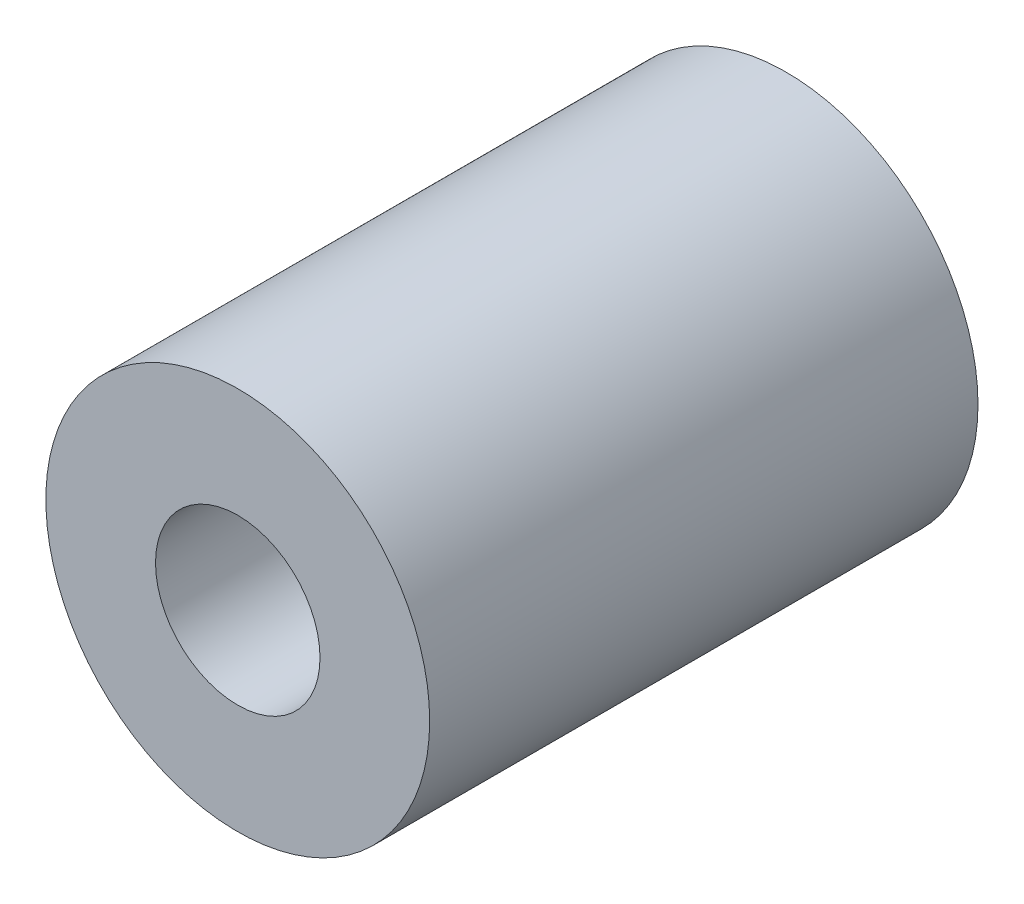
ISO-10303-21;
HEADER;
FILE_DESCRIPTION(('STEP AP214'),'2;1');
FILE_NAME('part.step','',(''),(''),'','','');
FILE_SCHEMA(('AUTOMOTIVE_DESIGN { 1 0 10303 214 1 1 1 1 }'));
ENDSEC;
DATA;
#1=APPLICATION_CONTEXT('core data for automotive mechanical design processes');
#2=APPLICATION_PROTOCOL_DEFINITION('international standard','automotive_design',2000,#1);
#3=PRODUCT_CONTEXT('',#1,'mechanical');
#4=PRODUCT('Part','Part','',(#3));
#5=PRODUCT_RELATED_PRODUCT_CATEGORY('part','',(#4));
#6=PRODUCT_DEFINITION_FORMATION('','',#4);
#7=PRODUCT_DEFINITION_CONTEXT('part definition',#1,'design');
#8=PRODUCT_DEFINITION('design','',#6,#7);
#9=PRODUCT_DEFINITION_SHAPE('','',#8);
#10=(LENGTH_UNIT() NAMED_UNIT(*) SI_UNIT(.MILLI.,.METRE.));
#11=(NAMED_UNIT(*) PLANE_ANGLE_UNIT() SI_UNIT($,.RADIAN.));
#12=(NAMED_UNIT(*) SI_UNIT($,.STERADIAN.) SOLID_ANGLE_UNIT());
#13=UNCERTAINTY_MEASURE_WITH_UNIT(LENGTH_MEASURE(1.E-05),#10,'distance_accuracy_value','');
#14=(GEOMETRIC_REPRESENTATION_CONTEXT(3) GLOBAL_UNCERTAINTY_ASSIGNED_CONTEXT((#13)) GLOBAL_UNIT_ASSIGNED_CONTEXT((#10,
#11,#12)) REPRESENTATION_CONTEXT('',''));
#15=CARTESIAN_POINT('',(0.,0.,0.));
#16=DIRECTION('',(0.,0.,1.));
#17=DIRECTION('',(1.,0.,0.));
#18=AXIS2_PLACEMENT_3D('',#15,#16,#17);
#19=CARTESIAN_POINT('',(0.,0.,10.));
#20=DIRECTION('',(0.,0.,1.));
#21=DIRECTION('',(1.,0.,0.));
#22=AXIS2_PLACEMENT_3D('',#19,#20,#21);
#23=PLANE('',#22);
#24=CARTESIAN_POINT('',(0.,0.,10.));
#25=DIRECTION('',(0.,0.,1.));
#26=DIRECTION('',(1.,0.,0.));
#27=AXIS2_PLACEMENT_3D('',#24,#25,#26);
#28=CIRCLE('',#27,3.5);
#29=CARTESIAN_POINT('',(3.5,0.,10.));
#30=VERTEX_POINT('',#29);
#31=EDGE_CURVE('E10',#30,#30,#28,.T.);
#32=ORIENTED_EDGE('',*,*,#31,.T.);
#33=EDGE_LOOP('',(#32));
#34=FACE_BOUND('',#33,.T.);
#35=CARTESIAN_POINT('',(0.,0.,10.));
#36=DIRECTION('',(0.,0.,1.));
#37=DIRECTION('',(1.,0.,0.));
#38=AXIS2_PLACEMENT_3D('',#35,#36,#37);
#39=CIRCLE('',#38,1.5);
#40=CARTESIAN_POINT('',(1.5,0.,10.));
#41=VERTEX_POINT('',#40);
#42=EDGE_CURVE('E50',#41,#41,#39,.T.);
#43=ORIENTED_EDGE('',*,*,#42,.F.);
#44=EDGE_LOOP('',(#43));
#45=FACE_BOUND('',#44,.T.);
#46=ADVANCED_FACE('F37',(#34,#45),#23,.T.);
#47=CARTESIAN_POINT('',(0.,0.,0.));
#48=DIRECTION('',(0.,0.,1.));
#49=DIRECTION('',(1.,0.,0.));
#50=AXIS2_PLACEMENT_3D('',#47,#48,#49);
#51=PLANE('',#50);
#52=CARTESIAN_POINT('',(0.,0.,0.));
#53=DIRECTION('',(0.,0.,1.));
#54=DIRECTION('',(1.,0.,0.));
#55=AXIS2_PLACEMENT_3D('',#52,#53,#54);
#56=CIRCLE('',#55,3.5);
#57=CARTESIAN_POINT('',(3.5,0.,0.));
#58=VERTEX_POINT('',#57);
#59=EDGE_CURVE('E41',#58,#58,#56,.T.);
#60=ORIENTED_EDGE('',*,*,#59,.F.);
#61=EDGE_LOOP('',(#60));
#62=FACE_BOUND('',#61,.T.);
#63=CARTESIAN_POINT('',(0.,0.,0.));
#64=DIRECTION('',(0.,0.,1.));
#65=DIRECTION('',(1.,0.,0.));
#66=AXIS2_PLACEMENT_3D('',#63,#64,#65);
#67=CIRCLE('',#66,1.5);
#68=CARTESIAN_POINT('',(1.5,0.,0.));
#69=VERTEX_POINT('',#68);
#70=EDGE_CURVE('E52',#69,#69,#67,.T.);
#71=ORIENTED_EDGE('',*,*,#70,.T.);
#72=EDGE_LOOP('',(#71));
#73=FACE_BOUND('',#72,.T.);
#74=ADVANCED_FACE('F64',(#62,#73),#51,.F.);
#75=CARTESIAN_POINT('',(0.,0.,10.));
#76=DIRECTION('',(0.,0.,-1.));
#77=DIRECTION('',(-1.,0.,0.));
#78=AXIS2_PLACEMENT_3D('',#75,#76,#77);
#79=CYLINDRICAL_SURFACE('',#78,3.5);
#80=ORIENTED_EDGE('',*,*,#31,.F.);
#81=EDGE_LOOP('',(#80));
#82=FACE_BOUND('',#81,.T.);
#83=ORIENTED_EDGE('',*,*,#59,.T.);
#84=EDGE_LOOP('',(#83));
#85=FACE_BOUND('',#84,.T.);
#86=ADVANCED_FACE('F39',(#82,#85),#79,.T.);
#87=CARTESIAN_POINT('',(0.,0.,10.));
#88=DIRECTION('',(0.,0.,-1.));
#89=DIRECTION('',(-1.,0.,0.));
#90=AXIS2_PLACEMENT_3D('',#87,#88,#89);
#91=CYLINDRICAL_SURFACE('',#90,1.5);
#92=ORIENTED_EDGE('',*,*,#42,.T.);
#93=EDGE_LOOP('',(#92));
#94=FACE_BOUND('',#93,.T.);
#95=ORIENTED_EDGE('',*,*,#70,.F.);
#96=EDGE_LOOP('',(#95));
#97=FACE_BOUND('',#96,.T.);
#98=ADVANCED_FACE('F60',(#94,#97),#91,.F.);
#99=CLOSED_SHELL('',(#46,#74,#86,#98));
#100=MANIFOLD_SOLID_BREP('B2',#99);
#101=ADVANCED_BREP_SHAPE_REPRESENTATION('',(#18,#100),#14);
#102=SHAPE_DEFINITION_REPRESENTATION(#9,#101);
ENDSEC;
END-ISO-10303-21;
